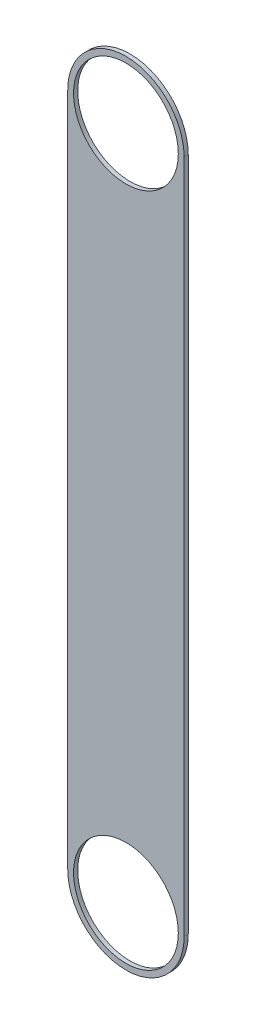
ISO-10303-21;
HEADER;
FILE_DESCRIPTION(('STEP AP214'),'2;1');
FILE_NAME('part.step','',(''),(''),'','','');
FILE_SCHEMA(('AUTOMOTIVE_DESIGN { 1 0 10303 214 1 1 1 1 }'));
ENDSEC;
DATA;
#1=APPLICATION_CONTEXT('core data for automotive mechanical design processes');
#2=APPLICATION_PROTOCOL_DEFINITION('international standard','automotive_design',2000,#1);
#3=PRODUCT_CONTEXT('',#1,'mechanical');
#4=PRODUCT('Part','Part','',(#3));
#5=PRODUCT_RELATED_PRODUCT_CATEGORY('part','',(#4));
#6=PRODUCT_DEFINITION_FORMATION('','',#4);
#7=PRODUCT_DEFINITION_CONTEXT('part definition',#1,'design');
#8=PRODUCT_DEFINITION('design','',#6,#7);
#9=PRODUCT_DEFINITION_SHAPE('','',#8);
#10=(LENGTH_UNIT() NAMED_UNIT(*) SI_UNIT(.MILLI.,.METRE.));
#11=(NAMED_UNIT(*) PLANE_ANGLE_UNIT() SI_UNIT($,.RADIAN.));
#12=(NAMED_UNIT(*) SI_UNIT($,.STERADIAN.) SOLID_ANGLE_UNIT());
#13=UNCERTAINTY_MEASURE_WITH_UNIT(LENGTH_MEASURE(1.E-05),#10,'distance_accuracy_value','');
#14=(GEOMETRIC_REPRESENTATION_CONTEXT(3) GLOBAL_UNCERTAINTY_ASSIGNED_CONTEXT((#13)) GLOBAL_UNIT_ASSIGNED_CONTEXT((#10,
#11,#12)) REPRESENTATION_CONTEXT('',''));
#15=CARTESIAN_POINT('',(0.,0.,0.));
#16=DIRECTION('',(0.,0.,1.));
#17=DIRECTION('',(1.,0.,0.));
#18=AXIS2_PLACEMENT_3D('',#15,#16,#17);
#19=CARTESIAN_POINT('',(46.5000086,62.5999764,0.));
#20=DIRECTION('',(-1.,0.,0.));
#21=DIRECTION('',(0.,1.,0.));
#22=AXIS2_PLACEMENT_3D('',#19,#20,#21);
#23=PLANE('',#22);
#24=DIRECTION('',(0.,1.,0.));
#25=VECTOR('',#24,1.);
#26=CARTESIAN_POINT('',(46.5000086,62.5999764,0.03556));
#27=LINE('',#26,#25);
#28=CARTESIAN_POINT('',(46.5000086,62.5999764,0.03556));
#29=VERTEX_POINT('',#28);
#30=CARTESIAN_POINT('',(46.5000086,68.4000156,0.03556));
#31=VERTEX_POINT('',#30);
#32=EDGE_CURVE('E11',#29,#31,#27,.T.);
#33=ORIENTED_EDGE('',*,*,#32,.F.);
#34=DIRECTION('',(0.,0.,1.));
#35=VECTOR('',#34,1.);
#36=CARTESIAN_POINT('',(46.5000086,62.5999764,0.));
#37=LINE('',#36,#35);
#38=CARTESIAN_POINT('',(46.5000086,62.5999764,0.));
#39=VERTEX_POINT('',#38);
#40=EDGE_CURVE('E24',#39,#29,#37,.T.);
#41=ORIENTED_EDGE('',*,*,#40,.F.);
#42=DIRECTION('',(0.,1.,0.));
#43=VECTOR('',#42,1.);
#44=CARTESIAN_POINT('',(46.5000086,62.5999764,0.));
#45=LINE('',#44,#43);
#46=CARTESIAN_POINT('',(46.5000086,68.4000156,0.));
#47=VERTEX_POINT('',#46);
#48=EDGE_CURVE('E110',#39,#47,#45,.T.);
#49=ORIENTED_EDGE('',*,*,#48,.T.);
#50=DIRECTION('',(0.,0.,1.));
#51=VECTOR('',#50,1.);
#52=CARTESIAN_POINT('',(46.5000086,68.4000156,0.));
#53=LINE('',#52,#51);
#54=EDGE_CURVE('E37',#47,#31,#53,.T.);
#55=ORIENTED_EDGE('',*,*,#54,.T.);
#56=EDGE_LOOP('',(#33,#41,#49,#55));
#57=FACE_BOUND('',#56,.T.);
#58=ADVANCED_FACE('F17',(#57),#23,.F.);
#59=CARTESIAN_POINT('',(46.0000096,62.5999764,0.));
#60=DIRECTION('',(0.,0.,-1.));
#61=DIRECTION('',(-1.,0.,0.));
#62=AXIS2_PLACEMENT_3D('',#59,#60,#61);
#63=CYLINDRICAL_SURFACE('',#62,0.499999);
#64=CARTESIAN_POINT('',(46.0000096,62.5999764,0.03556));
#65=DIRECTION('',(0.,0.,1.));
#66=DIRECTION('',(-1.,0.,0.));
#67=AXIS2_PLACEMENT_3D('',#64,#65,#66);
#68=CIRCLE('',#67,0.499999);
#69=CARTESIAN_POINT('',(45.5000106,62.5999764,0.03556));
#70=VERTEX_POINT('',#69);
#71=EDGE_CURVE('E106',#70,#29,#68,.T.);
#72=ORIENTED_EDGE('',*,*,#71,.F.);
#73=DIRECTION('',(0.,0.,1.));
#74=VECTOR('',#73,1.);
#75=CARTESIAN_POINT('',(45.5000106,62.5999764,0.));
#76=LINE('',#75,#74);
#77=CARTESIAN_POINT('',(45.5000106,62.5999764,0.));
#78=VERTEX_POINT('',#77);
#79=EDGE_CURVE('E104',#78,#70,#76,.T.);
#80=ORIENTED_EDGE('',*,*,#79,.F.);
#81=CARTESIAN_POINT('',(46.0000096,62.5999764,0.));
#82=DIRECTION('',(0.,0.,1.));
#83=DIRECTION('',(-1.,0.,0.));
#84=AXIS2_PLACEMENT_3D('',#81,#82,#83);
#85=CIRCLE('',#84,0.499999);
#86=EDGE_CURVE('E102',#78,#39,#85,.T.);
#87=ORIENTED_EDGE('',*,*,#86,.T.);
#88=ORIENTED_EDGE('',*,*,#40,.T.);
#89=EDGE_LOOP('',(#72,#80,#87,#88));
#90=FACE_BOUND('',#89,.T.);
#91=ADVANCED_FACE('F126',(#90),#63,.T.);
#92=CARTESIAN_POINT('',(46.0000096,68.4000156,0.));
#93=DIRECTION('',(0.,0.,-1.));
#94=DIRECTION('',(1.,0.,0.));
#95=AXIS2_PLACEMENT_3D('',#92,#93,#94);
#96=CYLINDRICAL_SURFACE('',#95,0.499999);
#97=CARTESIAN_POINT('',(46.0000096,68.4000156,0.03556));
#98=DIRECTION('',(0.,0.,1.));
#99=DIRECTION('',(1.,0.,0.));
#100=AXIS2_PLACEMENT_3D('',#97,#98,#99);
#101=CIRCLE('',#100,0.499999);
#102=CARTESIAN_POINT('',(45.5000106,68.4000156,0.03556));
#103=VERTEX_POINT('',#102);
#104=EDGE_CURVE('E99',#31,#103,#101,.T.);
#105=ORIENTED_EDGE('',*,*,#104,.F.);
#106=ORIENTED_EDGE('',*,*,#54,.F.);
#107=CARTESIAN_POINT('',(46.0000096,68.4000156,0.));
#108=DIRECTION('',(0.,0.,1.));
#109=DIRECTION('',(1.,0.,0.));
#110=AXIS2_PLACEMENT_3D('',#107,#108,#109);
#111=CIRCLE('',#110,0.499999);
#112=CARTESIAN_POINT('',(45.5000106,68.4000156,0.));
#113=VERTEX_POINT('',#112);
#114=EDGE_CURVE('E96',#47,#113,#111,.T.);
#115=ORIENTED_EDGE('',*,*,#114,.T.);
#116=DIRECTION('',(0.,0.,1.));
#117=VECTOR('',#116,1.);
#118=CARTESIAN_POINT('',(45.5000106,68.4000156,0.));
#119=LINE('',#118,#117);
#120=EDGE_CURVE('E94',#113,#103,#119,.T.);
#121=ORIENTED_EDGE('',*,*,#120,.T.);
#122=EDGE_LOOP('',(#105,#106,#115,#121));
#123=FACE_BOUND('',#122,.T.);
#124=ADVANCED_FACE('F119',(#123),#96,.T.);
#125=CARTESIAN_POINT('',(45.5000106,68.4000156,0.));
#126=DIRECTION('',(1.,0.,0.));
#127=DIRECTION('',(0.,-1.,0.));
#128=AXIS2_PLACEMENT_3D('',#125,#126,#127);
#129=PLANE('',#128);
#130=DIRECTION('',(0.,-1.,0.));
#131=VECTOR('',#130,1.);
#132=CARTESIAN_POINT('',(45.5000106,68.4000156,0.03556));
#133=LINE('',#132,#131);
#134=EDGE_CURVE('E91',#103,#70,#133,.T.);
#135=ORIENTED_EDGE('',*,*,#134,.F.);
#136=ORIENTED_EDGE('',*,*,#120,.F.);
#137=DIRECTION('',(0.,-1.,0.));
#138=VECTOR('',#137,1.);
#139=CARTESIAN_POINT('',(45.5000106,68.4000156,0.));
#140=LINE('',#139,#138);
#141=EDGE_CURVE('E88',#113,#78,#140,.T.);
#142=ORIENTED_EDGE('',*,*,#141,.T.);
#143=ORIENTED_EDGE('',*,*,#79,.T.);
#144=EDGE_LOOP('',(#135,#136,#142,#143));
#145=FACE_BOUND('',#144,.T.);
#146=ADVANCED_FACE('F125',(#145),#129,.F.);
#147=CARTESIAN_POINT('',(46.0000096,68.4000156,0.));
#148=DIRECTION('',(0.,0.,-1.));
#149=DIRECTION('',(1.,0.,0.));
#150=AXIS2_PLACEMENT_3D('',#147,#148,#149);
#151=CYLINDRICAL_SURFACE('',#150,0.4499991);
#152=DIRECTION('',(0.,0.,1.));
#153=VECTOR('',#152,1.);
#154=CARTESIAN_POINT('',(46.4500087,68.4000156,0.));
#155=LINE('',#154,#153);
#156=CARTESIAN_POINT('',(46.4500087,68.4000156,0.));
#157=VERTEX_POINT('',#156);
#158=CARTESIAN_POINT('',(46.4500087,68.4000156,0.03556));
#159=VERTEX_POINT('',#158);
#160=EDGE_CURVE('E86',#157,#159,#155,.T.);
#161=ORIENTED_EDGE('',*,*,#160,.T.);
#162=CARTESIAN_POINT('',(46.0000096,68.4000156,0.03556));
#163=DIRECTION('',(0.,0.,1.));
#164=DIRECTION('',(1.,0.,0.));
#165=AXIS2_PLACEMENT_3D('',#162,#163,#164);
#166=CIRCLE('',#165,0.4499991);
#167=EDGE_CURVE('E83',#159,#159,#166,.T.);
#168=ORIENTED_EDGE('',*,*,#167,.T.);
#169=ORIENTED_EDGE('',*,*,#160,.F.);
#170=CARTESIAN_POINT('',(46.0000096,68.4000156,0.));
#171=DIRECTION('',(0.,0.,1.));
#172=DIRECTION('',(1.,0.,0.));
#173=AXIS2_PLACEMENT_3D('',#170,#171,#172);
#174=CIRCLE('',#173,0.4499991);
#175=EDGE_CURVE('E74',#157,#157,#174,.T.);
#176=ORIENTED_EDGE('',*,*,#175,.F.);
#177=EDGE_LOOP('',(#161,#168,#169,#176));
#178=FACE_BOUND('',#177,.T.);
#179=ADVANCED_FACE('F137',(#178),#151,.F.);
#180=CARTESIAN_POINT('',(46.0000096,62.5999764,0.));
#181=DIRECTION('',(0.,0.,-1.));
#182=DIRECTION('',(1.,0.,0.));
#183=AXIS2_PLACEMENT_3D('',#180,#181,#182);
#184=CYLINDRICAL_SURFACE('',#183,0.4499991);
#185=DIRECTION('',(0.,0.,1.));
#186=VECTOR('',#185,1.);
#187=CARTESIAN_POINT('',(46.4500087,62.5999764,0.));
#188=LINE('',#187,#186);
#189=CARTESIAN_POINT('',(46.4500087,62.5999764,0.));
#190=VERTEX_POINT('',#189);
#191=CARTESIAN_POINT('',(46.4500087,62.5999764,0.03556));
#192=VERTEX_POINT('',#191);
#193=EDGE_CURVE('E68',#190,#192,#188,.T.);
#194=ORIENTED_EDGE('',*,*,#193,.T.);
#195=CARTESIAN_POINT('',(46.0000096,62.5999764,0.03556));
#196=DIRECTION('',(0.,0.,1.));
#197=DIRECTION('',(1.,0.,0.));
#198=AXIS2_PLACEMENT_3D('',#195,#196,#197);
#199=CIRCLE('',#198,0.4499991);
#200=EDGE_CURVE('E73',#192,#192,#199,.T.);
#201=ORIENTED_EDGE('',*,*,#200,.T.);
#202=ORIENTED_EDGE('',*,*,#193,.F.);
#203=CARTESIAN_POINT('',(46.0000096,62.5999764,0.));
#204=DIRECTION('',(0.,0.,1.));
#205=DIRECTION('',(1.,0.,0.));
#206=AXIS2_PLACEMENT_3D('',#203,#204,#205);
#207=CIRCLE('',#206,0.4499991);
#208=EDGE_CURVE('E71',#190,#190,#207,.T.);
#209=ORIENTED_EDGE('',*,*,#208,.F.);
#210=EDGE_LOOP('',(#194,#201,#202,#209));
#211=FACE_BOUND('',#210,.T.);
#212=ADVANCED_FACE('F70',(#211),#184,.F.);
#213=CARTESIAN_POINT('',(46.5000086,62.5999764,0.));
#214=DIRECTION('',(0.,0.,-1.));
#215=DIRECTION('',(-1.,0.,0.));
#216=AXIS2_PLACEMENT_3D('',#213,#214,#215);
#217=PLANE('',#216);
#218=ORIENTED_EDGE('',*,*,#48,.F.);
#219=ORIENTED_EDGE('',*,*,#86,.F.);
#220=ORIENTED_EDGE('',*,*,#141,.F.);
#221=ORIENTED_EDGE('',*,*,#114,.F.);
#222=EDGE_LOOP('',(#218,#219,#220,#221));
#223=FACE_BOUND('',#222,.T.);
#224=ORIENTED_EDGE('',*,*,#175,.T.);
#225=EDGE_LOOP('',(#224));
#226=FACE_BOUND('',#225,.T.);
#227=ORIENTED_EDGE('',*,*,#208,.T.);
#228=EDGE_LOOP('',(#227));
#229=FACE_BOUND('',#228,.T.);
#230=ADVANCED_FACE('F77',(#223,#226,#229),#217,.T.);
#231=CARTESIAN_POINT('',(46.5000086,62.5999764,0.03556));
#232=DIRECTION('',(0.,0.,-1.));
#233=DIRECTION('',(-1.,0.,0.));
#234=AXIS2_PLACEMENT_3D('',#231,#232,#233);
#235=PLANE('',#234);
#236=ORIENTED_EDGE('',*,*,#134,.T.);
#237=ORIENTED_EDGE('',*,*,#71,.T.);
#238=ORIENTED_EDGE('',*,*,#32,.T.);
#239=ORIENTED_EDGE('',*,*,#104,.T.);
#240=EDGE_LOOP('',(#236,#237,#238,#239));
#241=FACE_BOUND('',#240,.T.);
#242=ORIENTED_EDGE('',*,*,#167,.F.);
#243=EDGE_LOOP('',(#242));
#244=FACE_BOUND('',#243,.T.);
#245=ORIENTED_EDGE('',*,*,#200,.F.);
#246=EDGE_LOOP('',(#245));
#247=FACE_BOUND('',#246,.T.);
#248=ADVANCED_FACE('F122',(#241,#244,#247),#235,.F.);
#249=CLOSED_SHELL('',(#58,#91,#124,#146,#179,#212,#230,#248));
#250=MANIFOLD_SOLID_BREP('B1',#249);
#251=ADVANCED_BREP_SHAPE_REPRESENTATION('',(#18,#250),#14);
#252=SHAPE_DEFINITION_REPRESENTATION(#9,#251);
ENDSEC;
END-ISO-10303-21;
